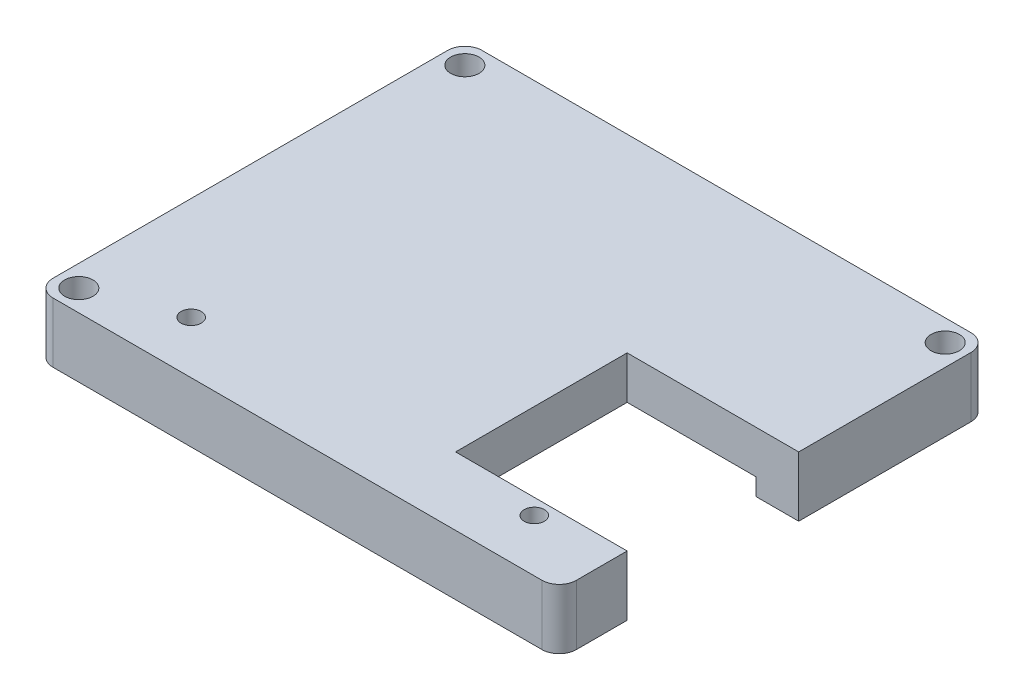
ISO-10303-21;
HEADER;
FILE_DESCRIPTION(('STEP AP214'),'2;1');
FILE_NAME('part.step','',(''),(''),'','','');
FILE_SCHEMA(('AUTOMOTIVE_DESIGN { 1 0 10303 214 1 1 1 1 }'));
ENDSEC;
DATA;
#1=APPLICATION_CONTEXT('core data for automotive mechanical design processes');
#2=APPLICATION_PROTOCOL_DEFINITION('international standard','automotive_design',2000,#1);
#3=PRODUCT_CONTEXT('',#1,'mechanical');
#4=PRODUCT('Part','Part','',(#3));
#5=PRODUCT_RELATED_PRODUCT_CATEGORY('part','',(#4));
#6=PRODUCT_DEFINITION_FORMATION('','',#4);
#7=PRODUCT_DEFINITION_CONTEXT('part definition',#1,'design');
#8=PRODUCT_DEFINITION('design','',#6,#7);
#9=PRODUCT_DEFINITION_SHAPE('','',#8);
#10=(LENGTH_UNIT() NAMED_UNIT(*) SI_UNIT(.MILLI.,.METRE.));
#11=(NAMED_UNIT(*) PLANE_ANGLE_UNIT() SI_UNIT($,.RADIAN.));
#12=(NAMED_UNIT(*) SI_UNIT($,.STERADIAN.) SOLID_ANGLE_UNIT());
#13=UNCERTAINTY_MEASURE_WITH_UNIT(LENGTH_MEASURE(1.E-05),#10,'distance_accuracy_value','');
#14=(GEOMETRIC_REPRESENTATION_CONTEXT(3) GLOBAL_UNCERTAINTY_ASSIGNED_CONTEXT((#13)) GLOBAL_UNIT_ASSIGNED_CONTEXT((#10,
#11,#12)) REPRESENTATION_CONTEXT('',''));
#15=CARTESIAN_POINT('',(0.,0.,0.));
#16=DIRECTION('',(0.,0.,1.));
#17=DIRECTION('',(1.,0.,0.));
#18=AXIS2_PLACEMENT_3D('',#15,#16,#17);
#19=CARTESIAN_POINT('',(71.12,6.35,0.));
#20=DIRECTION('',(1.,0.,0.));
#21=DIRECTION('',(0.,0.,-1.));
#22=AXIS2_PLACEMENT_3D('',#19,#20,#21);
#23=PLANE('',#22);
#24=DIRECTION('',(0.,0.,-1.));
#25=VECTOR('',#24,1.);
#26=CARTESIAN_POINT('',(71.12,-2.54,-58.2950819672131));
#27=LINE('',#26,#25);
#28=CARTESIAN_POINT('',(71.12,-2.54,-30.2565659568024));
#29=VERTEX_POINT('',#28);
#30=CARTESIAN_POINT('',(71.12,-2.54,-55.7550819672131));
#31=VERTEX_POINT('',#30);
#32=EDGE_CURVE('E187',#29,#31,#27,.T.);
#33=ORIENTED_EDGE('',*,*,#32,.T.);
#34=DIRECTION('',(0.,-1.,0.));
#35=VECTOR('',#34,1.);
#36=CARTESIAN_POINT('',(71.12,6.35,-55.7550819672131));
#37=LINE('',#36,#35);
#38=CARTESIAN_POINT('',(71.12,6.35,-55.7550819672131));
#39=VERTEX_POINT('',#38);
#40=EDGE_CURVE('E350',#31,#39,#37,.F.);
#41=ORIENTED_EDGE('',*,*,#40,.T.);
#42=DIRECTION('',(0.,0.,1.));
#43=VECTOR('',#42,1.);
#44=CARTESIAN_POINT('',(71.12,6.35,0.));
#45=LINE('',#44,#43);
#46=CARTESIAN_POINT('',(71.12,6.35,-30.2565659568024));
#47=VERTEX_POINT('',#46);
#48=EDGE_CURVE('E311',#39,#47,#45,.T.);
#49=ORIENTED_EDGE('',*,*,#48,.T.);
#50=DIRECTION('',(0.,-1.,0.));
#51=VECTOR('',#50,1.);
#52=CARTESIAN_POINT('',(71.12,10.16,-30.2565659568024));
#53=LINE('',#52,#51);
#54=EDGE_CURVE('E217',#47,#29,#53,.T.);
#55=ORIENTED_EDGE('',*,*,#54,.T.);
#56=EDGE_LOOP('',(#33,#41,#49,#55));
#57=FACE_BOUND('',#56,.T.);
#58=ADVANCED_FACE('F50',(#57),#23,.T.);
#59=CARTESIAN_POINT('',(64.77,-2.54,0.));
#60=DIRECTION('',(1.,0.,0.));
#61=DIRECTION('',(0.,0.,-1.));
#62=AXIS2_PLACEMENT_3D('',#59,#60,#61);
#63=PLANE('',#62);
#64=DIRECTION('',(0.,0.,-1.));
#65=VECTOR('',#64,1.);
#66=CARTESIAN_POINT('',(64.77,-2.54,0.));
#67=LINE('',#66,#65);
#68=CARTESIAN_POINT('',(64.77,-2.54,-30.2565659568024));
#69=VERTEX_POINT('',#68);
#70=CARTESIAN_POINT('',(64.77,-2.54,-50.8));
#71=VERTEX_POINT('',#70);
#72=EDGE_CURVE('E251',#69,#71,#67,.T.);
#73=ORIENTED_EDGE('',*,*,#72,.F.);
#74=DIRECTION('',(0.,1.,0.));
#75=VECTOR('',#74,1.);
#76=CARTESIAN_POINT('',(64.77,-2.54,-30.2565659568024));
#77=LINE('',#76,#75);
#78=CARTESIAN_POINT('',(64.77,0.,-30.2565659568024));
#79=VERTEX_POINT('',#78);
#80=EDGE_CURVE('E235',#69,#79,#77,.T.);
#81=ORIENTED_EDGE('',*,*,#80,.T.);
#82=DIRECTION('',(0.,0.,-1.));
#83=VECTOR('',#82,1.);
#84=CARTESIAN_POINT('',(64.77,0.,0.));
#85=LINE('',#84,#83);
#86=CARTESIAN_POINT('',(64.77,0.,-50.8));
#87=VERTEX_POINT('',#86);
#88=EDGE_CURVE('E266',#79,#87,#85,.T.);
#89=ORIENTED_EDGE('',*,*,#88,.T.);
#90=DIRECTION('',(0.,1.,0.));
#91=VECTOR('',#90,1.);
#92=CARTESIAN_POINT('',(64.77,-2.54,-50.8));
#93=LINE('',#92,#91);
#94=EDGE_CURVE('E279',#71,#87,#93,.T.);
#95=ORIENTED_EDGE('',*,*,#94,.F.);
#96=EDGE_LOOP('',(#73,#81,#89,#95));
#97=FACE_BOUND('',#96,.T.);
#98=ADVANCED_FACE('F381',(#97),#63,.F.);
#99=CARTESIAN_POINT('',(0.,6.35,-58.2950819672131));
#100=DIRECTION('',(0.,0.,1.));
#101=DIRECTION('',(1.,0.,0.));
#102=AXIS2_PLACEMENT_3D('',#99,#100,#101);
#103=PLANE('',#102);
#104=DIRECTION('',(-1.,0.,0.));
#105=VECTOR('',#104,1.);
#106=CARTESIAN_POINT('',(71.12,-2.54,-58.2950819672131));
#107=LINE('',#106,#105);
#108=CARTESIAN_POINT('',(68.58,-2.54,-58.2950819672131));
#109=VERTEX_POINT('',#108);
#110=CARTESIAN_POINT('',(-3.81000000000002,-2.54,-58.2950819672131));
#111=VERTEX_POINT('',#110);
#112=EDGE_CURVE('E186',#109,#111,#107,.T.);
#113=ORIENTED_EDGE('',*,*,#112,.T.);
#114=DIRECTION('',(0.,-1.,0.));
#115=VECTOR('',#114,1.);
#116=CARTESIAN_POINT('',(-3.81000000000002,6.35,-58.2950819672131));
#117=LINE('',#116,#115);
#118=CARTESIAN_POINT('',(-3.81000000000002,6.35,-58.2950819672131));
#119=VERTEX_POINT('',#118);
#120=EDGE_CURVE('E342',#111,#119,#117,.F.);
#121=ORIENTED_EDGE('',*,*,#120,.T.);
#122=DIRECTION('',(-1.,0.,0.));
#123=VECTOR('',#122,1.);
#124=CARTESIAN_POINT('',(0.,6.35,-58.2950819672131));
#125=LINE('',#124,#123);
#126=CARTESIAN_POINT('',(68.58,6.35,-58.2950819672131));
#127=VERTEX_POINT('',#126);
#128=EDGE_CURVE('E300',#127,#119,#125,.T.);
#129=ORIENTED_EDGE('',*,*,#128,.F.);
#130=DIRECTION('',(0.,-1.,0.));
#131=VECTOR('',#130,1.);
#132=CARTESIAN_POINT('',(68.58,-2.54,-58.2950819672131));
#133=LINE('',#132,#131);
#134=EDGE_CURVE('E339',#127,#109,#133,.T.);
#135=ORIENTED_EDGE('',*,*,#134,.T.);
#136=EDGE_LOOP('',(#113,#121,#129,#135));
#137=FACE_BOUND('',#136,.T.);
#138=ADVANCED_FACE('F388',(#137),#103,.F.);
#139=CARTESIAN_POINT('',(-6.35000000000001,6.35,0.));
#140=DIRECTION('',(1.,0.,0.));
#141=DIRECTION('',(0.,0.,-1.));
#142=AXIS2_PLACEMENT_3D('',#139,#140,#141);
#143=PLANE('',#142);
#144=DIRECTION('',(0.,0.,1.));
#145=VECTOR('',#144,1.);
#146=CARTESIAN_POINT('',(-6.35000000000001,6.35,0.));
#147=LINE('',#146,#145);
#148=CARTESIAN_POINT('',(-6.35000000000002,6.35,-55.7550819672131));
#149=VERTEX_POINT('',#148);
#150=CARTESIAN_POINT('',(-6.35000000000001,6.35,2.66491803278689));
#151=VERTEX_POINT('',#150);
#152=EDGE_CURVE('E304',#149,#151,#147,.T.);
#153=ORIENTED_EDGE('',*,*,#152,.F.);
#154=DIRECTION('',(0.,-1.,0.));
#155=VECTOR('',#154,1.);
#156=CARTESIAN_POINT('',(-6.35000000000002,6.35,-55.7550819672131));
#157=LINE('',#156,#155);
#158=CARTESIAN_POINT('',(-6.35000000000002,-2.54,-55.7550819672131));
#159=VERTEX_POINT('',#158);
#160=EDGE_CURVE('E328',#149,#159,#157,.T.);
#161=ORIENTED_EDGE('',*,*,#160,.T.);
#162=DIRECTION('',(0.,0.,1.));
#163=VECTOR('',#162,1.);
#164=CARTESIAN_POINT('',(-6.35000000000002,-2.54,-58.2950819672131));
#165=LINE('',#164,#163);
#166=CARTESIAN_POINT('',(-6.35000000000001,-2.54,2.66491803278689));
#167=VERTEX_POINT('',#166);
#168=EDGE_CURVE('E278',#159,#167,#165,.T.);
#169=ORIENTED_EDGE('',*,*,#168,.T.);
#170=DIRECTION('',(0.,-1.,0.));
#171=VECTOR('',#170,1.);
#172=CARTESIAN_POINT('',(-6.35000000000001,6.35,2.66491803278689));
#173=LINE('',#172,#171);
#174=EDGE_CURVE('E326',#167,#151,#173,.F.);
#175=ORIENTED_EDGE('',*,*,#174,.T.);
#176=EDGE_LOOP('',(#153,#161,#169,#175));
#177=FACE_BOUND('',#176,.T.);
#178=ADVANCED_FACE('F397',(#177),#143,.F.);
#179=CARTESIAN_POINT('',(0.,6.35,5.20491803278689));
#180=DIRECTION('',(0.,0.,1.));
#181=DIRECTION('',(1.,0.,0.));
#182=AXIS2_PLACEMENT_3D('',#179,#180,#181);
#183=PLANE('',#182);
#184=DIRECTION('',(1.,0.,0.));
#185=VECTOR('',#184,1.);
#186=CARTESIAN_POINT('',(71.12,-2.54,5.20491803278688));
#187=LINE('',#186,#185);
#188=CARTESIAN_POINT('',(-3.81000000000001,-2.54,5.20491803278689));
#189=VERTEX_POINT('',#188);
#190=CARTESIAN_POINT('',(68.58,-2.54,5.20491803278688));
#191=VERTEX_POINT('',#190);
#192=EDGE_CURVE('E293',#189,#191,#187,.T.);
#193=ORIENTED_EDGE('',*,*,#192,.T.);
#194=DIRECTION('',(0.,-1.,0.));
#195=VECTOR('',#194,1.);
#196=CARTESIAN_POINT('',(68.58,6.35,5.20491803278688));
#197=LINE('',#196,#195);
#198=CARTESIAN_POINT('',(68.58,6.35,5.20491803278688));
#199=VERTEX_POINT('',#198);
#200=EDGE_CURVE('E11',#191,#199,#197,.F.);
#201=ORIENTED_EDGE('',*,*,#200,.T.);
#202=DIRECTION('',(-1.,0.,0.));
#203=VECTOR('',#202,1.);
#204=CARTESIAN_POINT('',(0.,6.35,5.20491803278689));
#205=LINE('',#204,#203);
#206=CARTESIAN_POINT('',(-3.81000000000001,6.35,5.20491803278689));
#207=VERTEX_POINT('',#206);
#208=EDGE_CURVE('E307',#199,#207,#205,.T.);
#209=ORIENTED_EDGE('',*,*,#208,.T.);
#210=DIRECTION('',(0.,-1.,0.));
#211=VECTOR('',#210,1.);
#212=CARTESIAN_POINT('',(-3.81000000000001,-2.54,5.20491803278689));
#213=LINE('',#212,#211);
#214=EDGE_CURVE('E58',#207,#189,#213,.T.);
#215=ORIENTED_EDGE('',*,*,#214,.T.);
#216=EDGE_LOOP('',(#193,#201,#209,#215));
#217=FACE_BOUND('',#216,.T.);
#218=ADVANCED_FACE('F356',(#217),#183,.T.);
#219=CARTESIAN_POINT('',(71.12,6.35,-4.85656595680238));
#220=VERTEX_POINT('',#219);
#221=CARTESIAN_POINT('',(71.12,6.35,2.66491803278688));
#222=VERTEX_POINT('',#221);
#223=EDGE_CURVE('E310',#220,#222,#45,.T.);
#224=ORIENTED_EDGE('',*,*,#223,.T.);
#225=DIRECTION('',(0.,-1.,0.));
#226=VECTOR('',#225,1.);
#227=CARTESIAN_POINT('',(71.12,6.35,2.66491803278688));
#228=LINE('',#227,#226);
#229=CARTESIAN_POINT('',(71.12,-2.54,2.66491803278689));
#230=VERTEX_POINT('',#229);
#231=EDGE_CURVE('E182',#222,#230,#228,.T.);
#232=ORIENTED_EDGE('',*,*,#231,.T.);
#233=CARTESIAN_POINT('',(71.12,-2.54,-4.85656595680238));
#234=VERTEX_POINT('',#233);
#235=EDGE_CURVE('E177',#230,#234,#27,.T.);
#236=ORIENTED_EDGE('',*,*,#235,.T.);
#237=DIRECTION('',(0.,-1.,0.));
#238=VECTOR('',#237,1.);
#239=CARTESIAN_POINT('',(71.12,10.16,-4.85656595680238));
#240=LINE('',#239,#238);
#241=EDGE_CURVE('E180',#220,#234,#240,.T.);
#242=ORIENTED_EDGE('',*,*,#241,.F.);
#243=EDGE_LOOP('',(#224,#232,#236,#242));
#244=FACE_BOUND('',#243,.T.);
#245=ADVANCED_FACE('F179',(#244),#23,.T.);
#246=CARTESIAN_POINT('',(0.,6.35,0.));
#247=DIRECTION('',(0.,1.,0.));
#248=DIRECTION('',(0.,0.,1.));
#249=AXIS2_PLACEMENT_3D('',#246,#247,#248);
#250=PLANE('',#249);
#251=CARTESIAN_POINT('',(59.69,6.35,-2.54));
#252=DIRECTION('',(0.,1.,0.));
#253=DIRECTION('',(0.,0.,1.));
#254=AXIS2_PLACEMENT_3D('',#251,#252,#253);
#255=CIRCLE('',#254,1.5);
#256=CARTESIAN_POINT('',(59.69,6.35,-1.04));
#257=VERTEX_POINT('',#256);
#258=EDGE_CURVE('E438',#257,#257,#255,.T.);
#259=ORIENTED_EDGE('',*,*,#258,.F.);
#260=EDGE_LOOP('',(#259));
#261=FACE_BOUND('',#260,.T.);
#262=CARTESIAN_POINT('',(8.89,6.35,-2.54));
#263=DIRECTION('',(0.,1.,0.));
#264=DIRECTION('',(0.,0.,1.));
#265=AXIS2_PLACEMENT_3D('',#262,#263,#264);
#266=CIRCLE('',#265,1.5);
#267=CARTESIAN_POINT('',(8.89,6.35,-1.04));
#268=VERTEX_POINT('',#267);
#269=EDGE_CURVE('E689',#268,#268,#266,.T.);
#270=ORIENTED_EDGE('',*,*,#269,.F.);
#271=EDGE_LOOP('',(#270));
#272=FACE_BOUND('',#271,.T.);
#273=CARTESIAN_POINT('',(-3.17500000000002,6.35,2.0299180327869));
#274=DIRECTION('',(0.,1.,0.));
#275=DIRECTION('',(0.,0.,1.));
#276=AXIS2_PLACEMENT_3D('',#273,#274,#275);
#277=CIRCLE('',#276,2.1);
#278=CARTESIAN_POINT('',(-3.17500000000002,6.35,4.1299180327869));
#279=VERTEX_POINT('',#278);
#280=EDGE_CURVE('E206',#279,#279,#277,.T.);
#281=ORIENTED_EDGE('',*,*,#280,.F.);
#282=EDGE_LOOP('',(#281));
#283=FACE_BOUND('',#282,.T.);
#284=CARTESIAN_POINT('',(-3.17500000000003,6.35,-55.1200819672131));
#285=DIRECTION('',(0.,1.,0.));
#286=DIRECTION('',(0.,0.,1.));
#287=AXIS2_PLACEMENT_3D('',#284,#285,#286);
#288=CIRCLE('',#287,2.1);
#289=CARTESIAN_POINT('',(-3.17500000000003,6.35,-53.0200819672131));
#290=VERTEX_POINT('',#289);
#291=EDGE_CURVE('E213',#290,#290,#288,.T.);
#292=ORIENTED_EDGE('',*,*,#291,.F.);
#293=EDGE_LOOP('',(#292));
#294=FACE_BOUND('',#293,.T.);
#295=CARTESIAN_POINT('',(67.945,6.35,-55.1200819672131));
#296=DIRECTION('',(0.,1.,0.));
#297=DIRECTION('',(0.,0.,1.));
#298=AXIS2_PLACEMENT_3D('',#295,#296,#297);
#299=CIRCLE('',#298,2.1);
#300=CARTESIAN_POINT('',(67.945,6.35,-53.0200819672131));
#301=VERTEX_POINT('',#300);
#302=EDGE_CURVE('E672',#301,#301,#299,.T.);
#303=ORIENTED_EDGE('',*,*,#302,.F.);
#304=EDGE_LOOP('',(#303));
#305=FACE_BOUND('',#304,.T.);
#306=ORIENTED_EDGE('',*,*,#128,.T.);
#307=CARTESIAN_POINT('',(-3.81000000000002,6.35,-55.7550819672131));
#308=DIRECTION('',(0.,1.,0.));
#309=DIRECTION('',(0.,0.,1.));
#310=AXIS2_PLACEMENT_3D('',#307,#308,#309);
#311=CIRCLE('',#310,2.54);
#312=EDGE_CURVE('E348',#119,#149,#311,.T.);
#313=ORIENTED_EDGE('',*,*,#312,.T.);
#314=ORIENTED_EDGE('',*,*,#152,.T.);
#315=CARTESIAN_POINT('',(-3.81000000000001,6.35,2.66491803278689));
#316=DIRECTION('',(0.,1.,0.));
#317=DIRECTION('',(0.,0.,1.));
#318=AXIS2_PLACEMENT_3D('',#315,#316,#317);
#319=CIRCLE('',#318,2.54);
#320=EDGE_CURVE('E71',#151,#207,#319,.T.);
#321=ORIENTED_EDGE('',*,*,#320,.T.);
#322=ORIENTED_EDGE('',*,*,#208,.F.);
#323=CARTESIAN_POINT('',(68.58,6.35,2.66491803278688));
#324=DIRECTION('',(0.,1.,0.));
#325=DIRECTION('',(0.,0.,1.));
#326=AXIS2_PLACEMENT_3D('',#323,#324,#325);
#327=CIRCLE('',#326,2.54);
#328=EDGE_CURVE('E65',#199,#222,#327,.T.);
#329=ORIENTED_EDGE('',*,*,#328,.T.);
#330=ORIENTED_EDGE('',*,*,#223,.F.);
#331=DIRECTION('',(1.,0.,0.));
#332=VECTOR('',#331,1.);
#333=CARTESIAN_POINT('',(0.,6.35,-4.85656595680239));
#334=LINE('',#333,#332);
#335=CARTESIAN_POINT('',(45.72,6.35,-4.85656595680239));
#336=VERTEX_POINT('',#335);
#337=EDGE_CURVE('E195',#336,#220,#334,.T.);
#338=ORIENTED_EDGE('',*,*,#337,.F.);
#339=DIRECTION('',(0.,0.,1.));
#340=VECTOR('',#339,1.);
#341=CARTESIAN_POINT('',(45.72,6.35,0.));
#342=LINE('',#341,#340);
#343=CARTESIAN_POINT('',(45.72,6.35,-30.2565659568024));
#344=VERTEX_POINT('',#343);
#345=EDGE_CURVE('E232',#344,#336,#342,.T.);
#346=ORIENTED_EDGE('',*,*,#345,.F.);
#347=DIRECTION('',(-1.,0.,0.));
#348=VECTOR('',#347,1.);
#349=CARTESIAN_POINT('',(0.,6.35,-30.2565659568024));
#350=LINE('',#349,#348);
#351=EDGE_CURVE('E239',#47,#344,#350,.T.);
#352=ORIENTED_EDGE('',*,*,#351,.F.);
#353=ORIENTED_EDGE('',*,*,#48,.F.);
#354=CARTESIAN_POINT('',(68.58,6.35,-55.7550819672131));
#355=DIRECTION('',(0.,1.,0.));
#356=DIRECTION('',(0.,0.,1.));
#357=AXIS2_PLACEMENT_3D('',#354,#355,#356);
#358=CIRCLE('',#357,2.54);
#359=EDGE_CURVE('E346',#39,#127,#358,.T.);
#360=ORIENTED_EDGE('',*,*,#359,.T.);
#361=EDGE_LOOP('',(#306,#313,#314,#321,#322,#329,#330,#338,#346,#352,#353,#360));
#362=FACE_BOUND('',#361,.T.);
#363=ADVANCED_FACE('F361',(#261,#272,#283,#294,#305,#362),#250,.T.);
#364=CARTESIAN_POINT('',(0.,-2.54,0.));
#365=DIRECTION('',(0.,-1.,0.));
#366=DIRECTION('',(0.,0.,-1.));
#367=AXIS2_PLACEMENT_3D('',#364,#365,#366);
#368=PLANE('',#367);
#369=CARTESIAN_POINT('',(-3.17500000000002,-2.54,2.0299180327869));
#370=DIRECTION('',(0.,-1.,0.));
#371=DIRECTION('',(0.,0.,-1.));
#372=AXIS2_PLACEMENT_3D('',#369,#370,#371);
#373=CIRCLE('',#372,2.1);
#374=CARTESIAN_POINT('',(-3.17500000000002,-2.54,-0.0700819672131035));
#375=VERTEX_POINT('',#374);
#376=EDGE_CURVE('E677',#375,#375,#373,.T.);
#377=ORIENTED_EDGE('',*,*,#376,.F.);
#378=EDGE_LOOP('',(#377));
#379=FACE_BOUND('',#378,.T.);
#380=CARTESIAN_POINT('',(-3.17500000000003,-2.54,-55.1200819672131));
#381=DIRECTION('',(0.,-1.,0.));
#382=DIRECTION('',(0.,0.,-1.));
#383=AXIS2_PLACEMENT_3D('',#380,#381,#382);
#384=CIRCLE('',#383,2.1);
#385=CARTESIAN_POINT('',(-3.17500000000003,-2.54,-57.2200819672131));
#386=VERTEX_POINT('',#385);
#387=EDGE_CURVE('E437',#386,#386,#384,.T.);
#388=ORIENTED_EDGE('',*,*,#387,.F.);
#389=EDGE_LOOP('',(#388));
#390=FACE_BOUND('',#389,.T.);
#391=CARTESIAN_POINT('',(67.945,-2.54,-55.1200819672131));
#392=DIRECTION('',(0.,-1.,0.));
#393=DIRECTION('',(0.,0.,-1.));
#394=AXIS2_PLACEMENT_3D('',#391,#392,#393);
#395=CIRCLE('',#394,2.1);
#396=CARTESIAN_POINT('',(67.945,-2.54,-57.2200819672131));
#397=VERTEX_POINT('',#396);
#398=EDGE_CURVE('E435',#397,#397,#395,.T.);
#399=ORIENTED_EDGE('',*,*,#398,.F.);
#400=EDGE_LOOP('',(#399));
#401=FACE_BOUND('',#400,.T.);
#402=ORIENTED_EDGE('',*,*,#168,.F.);
#403=CARTESIAN_POINT('',(-3.81000000000002,-2.54,-55.7550819672131));
#404=DIRECTION('',(0.,-1.,0.));
#405=DIRECTION('',(0.,0.,-1.));
#406=AXIS2_PLACEMENT_3D('',#403,#404,#405);
#407=CIRCLE('',#406,2.54);
#408=EDGE_CURVE('E337',#159,#111,#407,.T.);
#409=ORIENTED_EDGE('',*,*,#408,.T.);
#410=ORIENTED_EDGE('',*,*,#112,.F.);
#411=CARTESIAN_POINT('',(68.58,-2.54,-55.7550819672131));
#412=DIRECTION('',(0.,-1.,0.));
#413=DIRECTION('',(0.,0.,-1.));
#414=AXIS2_PLACEMENT_3D('',#411,#412,#413);
#415=CIRCLE('',#414,2.54);
#416=EDGE_CURVE('E335',#109,#31,#415,.T.);
#417=ORIENTED_EDGE('',*,*,#416,.T.);
#418=ORIENTED_EDGE('',*,*,#32,.F.);
#419=DIRECTION('',(1.,0.,0.));
#420=VECTOR('',#419,1.);
#421=CARTESIAN_POINT('',(71.12,-2.54,-30.2565659568024));
#422=LINE('',#421,#420);
#423=EDGE_CURVE('E198',#69,#29,#422,.T.);
#424=ORIENTED_EDGE('',*,*,#423,.F.);
#425=ORIENTED_EDGE('',*,*,#72,.T.);
#426=DIRECTION('',(-1.,0.,0.));
#427=VECTOR('',#426,1.);
#428=CARTESIAN_POINT('',(0.,-2.54,-50.8));
#429=LINE('',#428,#427);
#430=CARTESIAN_POINT('',(0.,-2.54,-50.8));
#431=VERTEX_POINT('',#430);
#432=EDGE_CURVE('E254',#71,#431,#429,.T.);
#433=ORIENTED_EDGE('',*,*,#432,.T.);
#434=DIRECTION('',(0.,0.,1.));
#435=VECTOR('',#434,1.);
#436=CARTESIAN_POINT('',(0.,-2.54,0.));
#437=LINE('',#436,#435);
#438=CARTESIAN_POINT('',(0.,-2.54,0.));
#439=VERTEX_POINT('',#438);
#440=EDGE_CURVE('E243',#431,#439,#437,.T.);
#441=ORIENTED_EDGE('',*,*,#440,.T.);
#442=DIRECTION('',(1.,0.,0.));
#443=VECTOR('',#442,1.);
#444=CARTESIAN_POINT('',(0.,-2.54,0.));
#445=LINE('',#444,#443);
#446=CARTESIAN_POINT('',(64.77,-2.54,0.));
#447=VERTEX_POINT('',#446);
#448=EDGE_CURVE('E247',#439,#447,#445,.T.);
#449=ORIENTED_EDGE('',*,*,#448,.T.);
#450=CARTESIAN_POINT('',(64.77,-2.54,-4.85656595680238));
#451=VERTEX_POINT('',#450);
#452=EDGE_CURVE('E204',#447,#451,#67,.T.);
#453=ORIENTED_EDGE('',*,*,#452,.T.);
#454=DIRECTION('',(-1.,0.,0.));
#455=VECTOR('',#454,1.);
#456=CARTESIAN_POINT('',(71.12,-2.54,-4.85656595680238));
#457=LINE('',#456,#455);
#458=EDGE_CURVE('E191',#234,#451,#457,.T.);
#459=ORIENTED_EDGE('',*,*,#458,.F.);
#460=ORIENTED_EDGE('',*,*,#235,.F.);
#461=CARTESIAN_POINT('',(68.58,-2.54,2.66491803278688));
#462=DIRECTION('',(0.,-1.,0.));
#463=DIRECTION('',(0.,0.,-1.));
#464=AXIS2_PLACEMENT_3D('',#461,#462,#463);
#465=CIRCLE('',#464,2.54);
#466=EDGE_CURVE('E333',#230,#191,#465,.T.);
#467=ORIENTED_EDGE('',*,*,#466,.T.);
#468=ORIENTED_EDGE('',*,*,#192,.F.);
#469=CARTESIAN_POINT('',(-3.81000000000001,-2.54,2.66491803278689));
#470=DIRECTION('',(0.,-1.,0.));
#471=DIRECTION('',(0.,0.,-1.));
#472=AXIS2_PLACEMENT_3D('',#469,#470,#471);
#473=CIRCLE('',#472,2.54);
#474=EDGE_CURVE('E331',#189,#167,#473,.T.);
#475=ORIENTED_EDGE('',*,*,#474,.T.);
#476=EDGE_LOOP('',(#402,#409,#410,#417,#418,#424,#425,#433,#441,#449,#453,#459,#460,#467,#468,#475));
#477=FACE_BOUND('',#476,.T.);
#478=ADVANCED_FACE('F202',(#379,#390,#401,#477),#368,.T.);
#479=CARTESIAN_POINT('',(0.,-2.54,0.));
#480=DIRECTION('',(-1.,0.,0.));
#481=DIRECTION('',(0.,0.,1.));
#482=AXIS2_PLACEMENT_3D('',#479,#480,#481);
#483=PLANE('',#482);
#484=DIRECTION('',(0.,0.,1.));
#485=VECTOR('',#484,1.);
#486=CARTESIAN_POINT('',(0.,0.,0.));
#487=LINE('',#486,#485);
#488=CARTESIAN_POINT('',(0.,0.,-50.8));
#489=VERTEX_POINT('',#488);
#490=CARTESIAN_POINT('',(0.,0.,0.));
#491=VERTEX_POINT('',#490);
#492=EDGE_CURVE('E242',#489,#491,#487,.T.);
#493=ORIENTED_EDGE('',*,*,#492,.T.);
#494=DIRECTION('',(0.,1.,0.));
#495=VECTOR('',#494,1.);
#496=CARTESIAN_POINT('',(0.,-2.54,0.));
#497=LINE('',#496,#495);
#498=EDGE_CURVE('E258',#439,#491,#497,.T.);
#499=ORIENTED_EDGE('',*,*,#498,.F.);
#500=ORIENTED_EDGE('',*,*,#440,.F.);
#501=DIRECTION('',(0.,1.,0.));
#502=VECTOR('',#501,1.);
#503=CARTESIAN_POINT('',(0.,-2.54,-50.8));
#504=LINE('',#503,#502);
#505=EDGE_CURVE('E274',#431,#489,#504,.T.);
#506=ORIENTED_EDGE('',*,*,#505,.T.);
#507=EDGE_LOOP('',(#493,#499,#500,#506));
#508=FACE_BOUND('',#507,.T.);
#509=ADVANCED_FACE('F372',(#508),#483,.F.);
#510=CARTESIAN_POINT('',(0.,-2.54,-50.8));
#511=DIRECTION('',(0.,0.,-1.));
#512=DIRECTION('',(-1.,0.,0.));
#513=AXIS2_PLACEMENT_3D('',#510,#511,#512);
#514=PLANE('',#513);
#515=DIRECTION('',(-1.,0.,0.));
#516=VECTOR('',#515,1.);
#517=CARTESIAN_POINT('',(0.,0.,-50.8));
#518=LINE('',#517,#516);
#519=EDGE_CURVE('E248',#87,#489,#518,.T.);
#520=ORIENTED_EDGE('',*,*,#519,.T.);
#521=ORIENTED_EDGE('',*,*,#505,.F.);
#522=ORIENTED_EDGE('',*,*,#432,.F.);
#523=ORIENTED_EDGE('',*,*,#94,.T.);
#524=EDGE_LOOP('',(#520,#521,#522,#523));
#525=FACE_BOUND('',#524,.T.);
#526=ADVANCED_FACE('F458',(#525),#514,.F.);
#527=CARTESIAN_POINT('',(64.77,0.,0.));
#528=VERTEX_POINT('',#527);
#529=CARTESIAN_POINT('',(64.77,0.,-4.85656595680239));
#530=VERTEX_POINT('',#529);
#531=EDGE_CURVE('E267',#528,#530,#85,.T.);
#532=ORIENTED_EDGE('',*,*,#531,.T.);
#533=DIRECTION('',(0.,-1.,0.));
#534=VECTOR('',#533,1.);
#535=CARTESIAN_POINT('',(64.77,-2.54,-4.85656595680238));
#536=LINE('',#535,#534);
#537=EDGE_CURVE('E220',#530,#451,#536,.T.);
#538=ORIENTED_EDGE('',*,*,#537,.T.);
#539=ORIENTED_EDGE('',*,*,#452,.F.);
#540=DIRECTION('',(0.,1.,0.));
#541=VECTOR('',#540,1.);
#542=CARTESIAN_POINT('',(64.77,-2.54,0.));
#543=LINE('',#542,#541);
#544=EDGE_CURVE('E283',#447,#528,#543,.T.);
#545=ORIENTED_EDGE('',*,*,#544,.T.);
#546=EDGE_LOOP('',(#532,#538,#539,#545));
#547=FACE_BOUND('',#546,.T.);
#548=ADVANCED_FACE('F391',(#547),#63,.F.);
#549=CARTESIAN_POINT('',(0.,-2.54,0.));
#550=DIRECTION('',(0.,0.,1.));
#551=DIRECTION('',(1.,0.,0.));
#552=AXIS2_PLACEMENT_3D('',#549,#550,#551);
#553=PLANE('',#552);
#554=DIRECTION('',(1.,0.,0.));
#555=VECTOR('',#554,1.);
#556=CARTESIAN_POINT('',(0.,0.,0.));
#557=LINE('',#556,#555);
#558=EDGE_CURVE('E262',#491,#528,#557,.T.);
#559=ORIENTED_EDGE('',*,*,#558,.T.);
#560=ORIENTED_EDGE('',*,*,#544,.F.);
#561=ORIENTED_EDGE('',*,*,#448,.F.);
#562=ORIENTED_EDGE('',*,*,#498,.T.);
#563=EDGE_LOOP('',(#559,#560,#561,#562));
#564=FACE_BOUND('',#563,.T.);
#565=ADVANCED_FACE('F452',(#564),#553,.F.);
#566=CARTESIAN_POINT('',(0.,0.,0.));
#567=DIRECTION('',(0.,1.,0.));
#568=DIRECTION('',(0.,0.,1.));
#569=AXIS2_PLACEMENT_3D('',#566,#567,#568);
#570=PLANE('',#569);
#571=CARTESIAN_POINT('',(59.69,0.,-2.54));
#572=DIRECTION('',(0.,-1.,0.));
#573=DIRECTION('',(0.,0.,-1.));
#574=AXIS2_PLACEMENT_3D('',#571,#572,#573);
#575=CIRCLE('',#574,1.5);
#576=CARTESIAN_POINT('',(59.69,0.,-4.04));
#577=VERTEX_POINT('',#576);
#578=EDGE_CURVE('E692',#577,#577,#575,.T.);
#579=ORIENTED_EDGE('',*,*,#578,.F.);
#580=EDGE_LOOP('',(#579));
#581=FACE_BOUND('',#580,.T.);
#582=CARTESIAN_POINT('',(8.89,0.,-2.54));
#583=DIRECTION('',(0.,-1.,0.));
#584=DIRECTION('',(0.,0.,-1.));
#585=AXIS2_PLACEMENT_3D('',#582,#583,#584);
#586=CIRCLE('',#585,1.5);
#587=CARTESIAN_POINT('',(8.89,0.,-4.04));
#588=VERTEX_POINT('',#587);
#589=EDGE_CURVE('E693',#588,#588,#586,.T.);
#590=ORIENTED_EDGE('',*,*,#589,.F.);
#591=EDGE_LOOP('',(#590));
#592=FACE_BOUND('',#591,.T.);
#593=ORIENTED_EDGE('',*,*,#88,.F.);
#594=DIRECTION('',(-1.,0.,0.));
#595=VECTOR('',#594,1.);
#596=CARTESIAN_POINT('',(0.,0.,-30.2565659568024));
#597=LINE('',#596,#595);
#598=CARTESIAN_POINT('',(45.72,0.,-30.2565659568024));
#599=VERTEX_POINT('',#598);
#600=EDGE_CURVE('E322',#79,#599,#597,.T.);
#601=ORIENTED_EDGE('',*,*,#600,.T.);
#602=DIRECTION('',(0.,0.,1.));
#603=VECTOR('',#602,1.);
#604=CARTESIAN_POINT('',(45.72,0.,0.));
#605=LINE('',#604,#603);
#606=CARTESIAN_POINT('',(45.72,0.,-4.85656595680239));
#607=VERTEX_POINT('',#606);
#608=EDGE_CURVE('E318',#599,#607,#605,.T.);
#609=ORIENTED_EDGE('',*,*,#608,.T.);
#610=DIRECTION('',(1.,0.,0.));
#611=VECTOR('',#610,1.);
#612=CARTESIAN_POINT('',(0.,0.,-4.85656595680239));
#613=LINE('',#612,#611);
#614=EDGE_CURVE('E314',#607,#530,#613,.T.);
#615=ORIENTED_EDGE('',*,*,#614,.T.);
#616=ORIENTED_EDGE('',*,*,#531,.F.);
#617=ORIENTED_EDGE('',*,*,#558,.F.);
#618=ORIENTED_EDGE('',*,*,#492,.F.);
#619=ORIENTED_EDGE('',*,*,#519,.F.);
#620=EDGE_LOOP('',(#593,#601,#609,#615,#616,#617,#618,#619));
#621=FACE_BOUND('',#620,.T.);
#622=ADVANCED_FACE('F394',(#581,#592,#621),#570,.F.);
#623=CARTESIAN_POINT('',(71.12,10.16,-30.2565659568024));
#624=DIRECTION('',(0.,0.,-1.));
#625=DIRECTION('',(-1.,0.,0.));
#626=AXIS2_PLACEMENT_3D('',#623,#624,#625);
#627=PLANE('',#626);
#628=ORIENTED_EDGE('',*,*,#351,.T.);
#629=DIRECTION('',(0.,-1.,0.));
#630=VECTOR('',#629,1.);
#631=CARTESIAN_POINT('',(45.72,10.16,-30.2565659568024));
#632=LINE('',#631,#630);
#633=EDGE_CURVE('E221',#344,#599,#632,.T.);
#634=ORIENTED_EDGE('',*,*,#633,.T.);
#635=ORIENTED_EDGE('',*,*,#600,.F.);
#636=ORIENTED_EDGE('',*,*,#80,.F.);
#637=ORIENTED_EDGE('',*,*,#423,.T.);
#638=ORIENTED_EDGE('',*,*,#54,.F.);
#639=EDGE_LOOP('',(#628,#634,#635,#636,#637,#638));
#640=FACE_BOUND('',#639,.T.);
#641=ADVANCED_FACE('F465',(#640),#627,.F.);
#642=CARTESIAN_POINT('',(45.72,10.16,-4.85656595680239));
#643=DIRECTION('',(-1.,0.,0.));
#644=DIRECTION('',(0.,0.,1.));
#645=AXIS2_PLACEMENT_3D('',#642,#643,#644);
#646=PLANE('',#645);
#647=ORIENTED_EDGE('',*,*,#345,.T.);
#648=DIRECTION('',(0.,-1.,0.));
#649=VECTOR('',#648,1.);
#650=CARTESIAN_POINT('',(45.72,10.16,-4.85656595680239));
#651=LINE('',#650,#649);
#652=EDGE_CURVE('E197',#336,#607,#651,.T.);
#653=ORIENTED_EDGE('',*,*,#652,.T.);
#654=ORIENTED_EDGE('',*,*,#608,.F.);
#655=ORIENTED_EDGE('',*,*,#633,.F.);
#656=EDGE_LOOP('',(#647,#653,#654,#655));
#657=FACE_BOUND('',#656,.T.);
#658=ADVANCED_FACE('F445',(#657),#646,.F.);
#659=CARTESIAN_POINT('',(71.12,10.16,-4.85656595680238));
#660=DIRECTION('',(0.,0.,1.));
#661=DIRECTION('',(1.,0.,0.));
#662=AXIS2_PLACEMENT_3D('',#659,#660,#661);
#663=PLANE('',#662);
#664=ORIENTED_EDGE('',*,*,#337,.T.);
#665=ORIENTED_EDGE('',*,*,#241,.T.);
#666=ORIENTED_EDGE('',*,*,#458,.T.);
#667=ORIENTED_EDGE('',*,*,#537,.F.);
#668=ORIENTED_EDGE('',*,*,#614,.F.);
#669=ORIENTED_EDGE('',*,*,#652,.F.);
#670=EDGE_LOOP('',(#664,#665,#666,#667,#668,#669));
#671=FACE_BOUND('',#670,.T.);
#672=ADVANCED_FACE('F190',(#671),#663,.F.);
#673=CARTESIAN_POINT('',(67.945,10.16,-55.1200819672131));
#674=DIRECTION('',(0.,-1.,0.));
#675=DIRECTION('',(0.,0.,-1.));
#676=AXIS2_PLACEMENT_3D('',#673,#674,#675);
#677=CYLINDRICAL_SURFACE('',#676,2.1);
#678=ORIENTED_EDGE('',*,*,#302,.T.);
#679=EDGE_LOOP('',(#678));
#680=FACE_BOUND('',#679,.T.);
#681=ORIENTED_EDGE('',*,*,#398,.T.);
#682=EDGE_LOOP('',(#681));
#683=FACE_BOUND('',#682,.T.);
#684=ADVANCED_FACE('F474',(#680,#683),#677,.F.);
#685=CARTESIAN_POINT('',(-3.17500000000003,10.16,-55.1200819672131));
#686=DIRECTION('',(0.,-1.,0.));
#687=DIRECTION('',(0.,0.,-1.));
#688=AXIS2_PLACEMENT_3D('',#685,#686,#687);
#689=CYLINDRICAL_SURFACE('',#688,2.1);
#690=ORIENTED_EDGE('',*,*,#291,.T.);
#691=EDGE_LOOP('',(#690));
#692=FACE_BOUND('',#691,.T.);
#693=ORIENTED_EDGE('',*,*,#387,.T.);
#694=EDGE_LOOP('',(#693));
#695=FACE_BOUND('',#694,.T.);
#696=ADVANCED_FACE('F544',(#692,#695),#689,.F.);
#697=CARTESIAN_POINT('',(-3.17500000000002,10.16,2.0299180327869));
#698=DIRECTION('',(0.,-1.,0.));
#699=DIRECTION('',(0.,0.,-1.));
#700=AXIS2_PLACEMENT_3D('',#697,#698,#699);
#701=CYLINDRICAL_SURFACE('',#700,2.1);
#702=ORIENTED_EDGE('',*,*,#280,.T.);
#703=EDGE_LOOP('',(#702));
#704=FACE_BOUND('',#703,.T.);
#705=ORIENTED_EDGE('',*,*,#376,.T.);
#706=EDGE_LOOP('',(#705));
#707=FACE_BOUND('',#706,.T.);
#708=ADVANCED_FACE('F407',(#704,#707),#701,.F.);
#709=CARTESIAN_POINT('',(-3.81000000000002,6.35,-55.7550819672131));
#710=DIRECTION('',(0.,-1.,0.));
#711=DIRECTION('',(0.,0.,-1.));
#712=AXIS2_PLACEMENT_3D('',#709,#710,#711);
#713=CYLINDRICAL_SURFACE('',#712,2.54);
#714=ORIENTED_EDGE('',*,*,#312,.F.);
#715=ORIENTED_EDGE('',*,*,#120,.F.);
#716=ORIENTED_EDGE('',*,*,#408,.F.);
#717=ORIENTED_EDGE('',*,*,#160,.F.);
#718=EDGE_LOOP('',(#714,#715,#716,#717));
#719=FACE_BOUND('',#718,.T.);
#720=ADVANCED_FACE('F403',(#719),#713,.T.);
#721=CARTESIAN_POINT('',(68.58,6.35,-55.7550819672131));
#722=DIRECTION('',(0.,1.,0.));
#723=DIRECTION('',(0.,0.,1.));
#724=AXIS2_PLACEMENT_3D('',#721,#722,#723);
#725=CYLINDRICAL_SURFACE('',#724,2.54);
#726=ORIENTED_EDGE('',*,*,#359,.F.);
#727=ORIENTED_EDGE('',*,*,#40,.F.);
#728=ORIENTED_EDGE('',*,*,#416,.F.);
#729=ORIENTED_EDGE('',*,*,#134,.F.);
#730=EDGE_LOOP('',(#726,#727,#728,#729));
#731=FACE_BOUND('',#730,.T.);
#732=ADVANCED_FACE('F406',(#731),#725,.T.);
#733=CARTESIAN_POINT('',(68.58,6.35,2.66491803278688));
#734=DIRECTION('',(0.,-1.,0.));
#735=DIRECTION('',(0.,0.,-1.));
#736=AXIS2_PLACEMENT_3D('',#733,#734,#735);
#737=CYLINDRICAL_SURFACE('',#736,2.54);
#738=ORIENTED_EDGE('',*,*,#328,.F.);
#739=ORIENTED_EDGE('',*,*,#200,.F.);
#740=ORIENTED_EDGE('',*,*,#466,.F.);
#741=ORIENTED_EDGE('',*,*,#231,.F.);
#742=EDGE_LOOP('',(#738,#739,#740,#741));
#743=FACE_BOUND('',#742,.T.);
#744=ADVANCED_FACE('F360',(#743),#737,.T.);
#745=CARTESIAN_POINT('',(-3.81000000000001,6.35,2.66491803278689));
#746=DIRECTION('',(0.,1.,0.));
#747=DIRECTION('',(0.,0.,1.));
#748=AXIS2_PLACEMENT_3D('',#745,#746,#747);
#749=CYLINDRICAL_SURFACE('',#748,2.54);
#750=ORIENTED_EDGE('',*,*,#320,.F.);
#751=ORIENTED_EDGE('',*,*,#174,.F.);
#752=ORIENTED_EDGE('',*,*,#474,.F.);
#753=ORIENTED_EDGE('',*,*,#214,.F.);
#754=EDGE_LOOP('',(#750,#751,#752,#753));
#755=FACE_BOUND('',#754,.T.);
#756=ADVANCED_FACE('F52',(#755),#749,.T.);
#757=CARTESIAN_POINT('',(8.89,22.86,-2.54));
#758=DIRECTION('',(0.,-1.,0.));
#759=DIRECTION('',(0.,0.,-1.));
#760=AXIS2_PLACEMENT_3D('',#757,#758,#759);
#761=CYLINDRICAL_SURFACE('',#760,1.5);
#762=ORIENTED_EDGE('',*,*,#269,.T.);
#763=EDGE_LOOP('',(#762));
#764=FACE_BOUND('',#763,.T.);
#765=ORIENTED_EDGE('',*,*,#589,.T.);
#766=EDGE_LOOP('',(#765));
#767=FACE_BOUND('',#766,.T.);
#768=ADVANCED_FACE('F414',(#764,#767),#761,.F.);
#769=CARTESIAN_POINT('',(59.69,22.86,-2.54));
#770=DIRECTION('',(0.,-1.,0.));
#771=DIRECTION('',(0.,0.,-1.));
#772=AXIS2_PLACEMENT_3D('',#769,#770,#771);
#773=CYLINDRICAL_SURFACE('',#772,1.5);
#774=ORIENTED_EDGE('',*,*,#258,.T.);
#775=EDGE_LOOP('',(#774));
#776=FACE_BOUND('',#775,.T.);
#777=ORIENTED_EDGE('',*,*,#578,.T.);
#778=EDGE_LOOP('',(#777));
#779=FACE_BOUND('',#778,.T.);
#780=ADVANCED_FACE('F418',(#776,#779),#773,.F.);
#781=CLOSED_SHELL('',(#58,#98,#138,#178,#218,#245,#363,#478,#509,#526,#548,#565,#622,#641,#658,
#672,#684,#696,#708,#720,#732,#744,#756,#768,#780));
#782=MANIFOLD_SOLID_BREP('B2',#781);
#783=ADVANCED_BREP_SHAPE_REPRESENTATION('',(#18,#782),#14);
#784=SHAPE_DEFINITION_REPRESENTATION(#9,#783);
ENDSEC;
END-ISO-10303-21;
